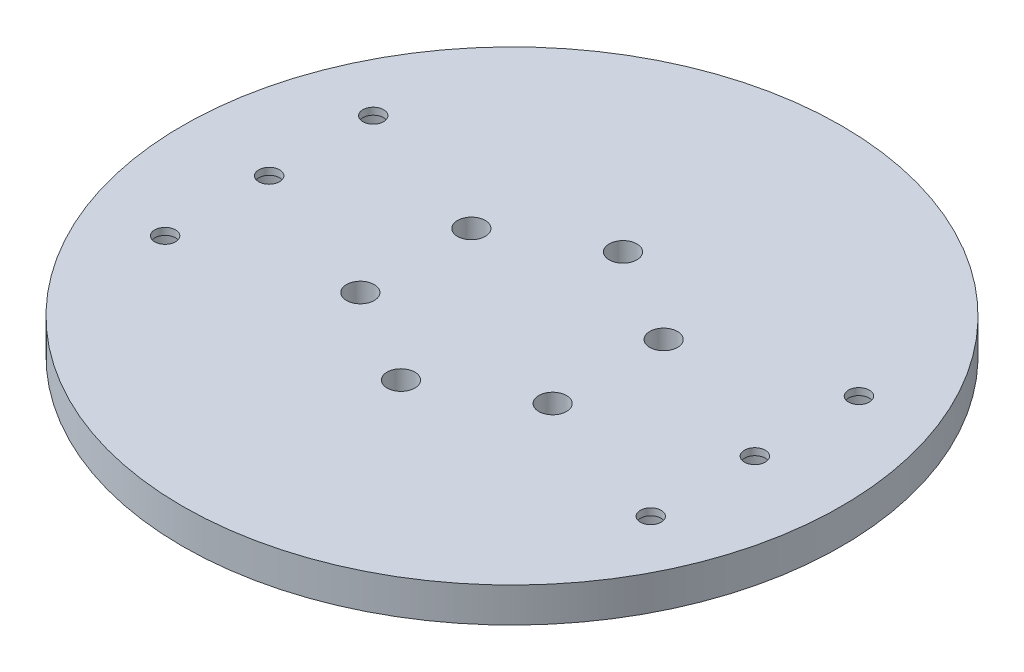
ISO-10303-21;
HEADER;
FILE_DESCRIPTION(('STEP AP214'),'2;1');
FILE_NAME('part.step','',(''),(''),'','','');
FILE_SCHEMA(('AUTOMOTIVE_DESIGN { 1 0 10303 214 1 1 1 1 }'));
ENDSEC;
DATA;
#1=APPLICATION_CONTEXT('core data for automotive mechanical design processes');
#2=APPLICATION_PROTOCOL_DEFINITION('international standard','automotive_design',2000,#1);
#3=PRODUCT_CONTEXT('',#1,'mechanical');
#4=PRODUCT('Part','Part','',(#3));
#5=PRODUCT_RELATED_PRODUCT_CATEGORY('part','',(#4));
#6=PRODUCT_DEFINITION_FORMATION('','',#4);
#7=PRODUCT_DEFINITION_CONTEXT('part definition',#1,'design');
#8=PRODUCT_DEFINITION('design','',#6,#7);
#9=PRODUCT_DEFINITION_SHAPE('','',#8);
#10=(LENGTH_UNIT() NAMED_UNIT(*) SI_UNIT(.MILLI.,.METRE.));
#11=(NAMED_UNIT(*) PLANE_ANGLE_UNIT() SI_UNIT($,.RADIAN.));
#12=(NAMED_UNIT(*) SI_UNIT($,.STERADIAN.) SOLID_ANGLE_UNIT());
#13=UNCERTAINTY_MEASURE_WITH_UNIT(LENGTH_MEASURE(1.E-05),#10,'distance_accuracy_value','');
#14=(GEOMETRIC_REPRESENTATION_CONTEXT(3) GLOBAL_UNCERTAINTY_ASSIGNED_CONTEXT((#13)) GLOBAL_UNIT_ASSIGNED_CONTEXT((#10,
#11,#12)) REPRESENTATION_CONTEXT('',''));
#15=CARTESIAN_POINT('',(0.,0.,0.));
#16=DIRECTION('',(0.,0.,1.));
#17=DIRECTION('',(1.,0.,0.));
#18=AXIS2_PLACEMENT_3D('',#15,#16,#17);
#19=CARTESIAN_POINT('',(-35.,0.,15.));
#20=DIRECTION('',(0.,1.,0.));
#21=DIRECTION('',(0.,0.,1.));
#22=AXIS2_PLACEMENT_3D('',#19,#20,#21);
#23=CYLINDRICAL_SURFACE('',#22,1.5);
#24=CARTESIAN_POINT('',(-35.,9.,15.));
#25=DIRECTION('',(0.,1.,0.));
#26=DIRECTION('',(0.,0.,1.));
#27=AXIS2_PLACEMENT_3D('',#24,#25,#26);
#28=CIRCLE('',#27,1.5);
#29=CARTESIAN_POINT('',(-35.,9.,16.5));
#30=VERTEX_POINT('',#29);
#31=EDGE_CURVE('E91',#30,#30,#28,.T.);
#32=ORIENTED_EDGE('',*,*,#31,.T.);
#33=EDGE_LOOP('',(#32));
#34=FACE_BOUND('',#33,.T.);
#35=CARTESIAN_POINT('',(-35.,8.,15.));
#36=DIRECTION('',(0.,-1.,0.));
#37=DIRECTION('',(0.,0.,-1.));
#38=AXIS2_PLACEMENT_3D('',#35,#36,#37);
#39=CIRCLE('',#38,1.5);
#40=CARTESIAN_POINT('',(-35.,8.,13.5));
#41=VERTEX_POINT('',#40);
#42=EDGE_CURVE('E129',#41,#41,#39,.T.);
#43=ORIENTED_EDGE('',*,*,#42,.T.);
#44=EDGE_LOOP('',(#43));
#45=FACE_BOUND('',#44,.T.);
#46=ADVANCED_FACE('F36',(#34,#45),#23,.F.);
#47=CARTESIAN_POINT('',(-35.,0.,0.));
#48=DIRECTION('',(0.,1.,0.));
#49=DIRECTION('',(0.,0.,1.));
#50=AXIS2_PLACEMENT_3D('',#47,#48,#49);
#51=CYLINDRICAL_SURFACE('',#50,1.5);
#52=CARTESIAN_POINT('',(-35.,9.,0.));
#53=DIRECTION('',(0.,1.,0.));
#54=DIRECTION('',(0.,0.,1.));
#55=AXIS2_PLACEMENT_3D('',#52,#53,#54);
#56=CIRCLE('',#55,1.5);
#57=CARTESIAN_POINT('',(-35.,9.,1.5));
#58=VERTEX_POINT('',#57);
#59=EDGE_CURVE('E94',#58,#58,#56,.T.);
#60=ORIENTED_EDGE('',*,*,#59,.T.);
#61=EDGE_LOOP('',(#60));
#62=FACE_BOUND('',#61,.T.);
#63=CARTESIAN_POINT('',(-35.,8.,0.));
#64=DIRECTION('',(0.,-1.,0.));
#65=DIRECTION('',(0.,0.,-1.));
#66=AXIS2_PLACEMENT_3D('',#63,#64,#65);
#67=CIRCLE('',#66,1.5);
#68=CARTESIAN_POINT('',(-35.,8.,-1.50000000000001));
#69=VERTEX_POINT('',#68);
#70=EDGE_CURVE('E118',#69,#69,#67,.T.);
#71=ORIENTED_EDGE('',*,*,#70,.T.);
#72=EDGE_LOOP('',(#71));
#73=FACE_BOUND('',#72,.T.);
#74=ADVANCED_FACE('F189',(#62,#73),#51,.F.);
#75=CARTESIAN_POINT('',(-35.,0.,-15.));
#76=DIRECTION('',(0.,1.,0.));
#77=DIRECTION('',(0.,0.,1.));
#78=AXIS2_PLACEMENT_3D('',#75,#76,#77);
#79=CYLINDRICAL_SURFACE('',#78,1.5);
#80=CARTESIAN_POINT('',(-35.,9.,-15.));
#81=DIRECTION('',(0.,1.,0.));
#82=DIRECTION('',(0.,0.,1.));
#83=AXIS2_PLACEMENT_3D('',#80,#81,#82);
#84=CIRCLE('',#83,1.5);
#85=CARTESIAN_POINT('',(-35.,9.,-13.5));
#86=VERTEX_POINT('',#85);
#87=EDGE_CURVE('E90',#86,#86,#84,.T.);
#88=ORIENTED_EDGE('',*,*,#87,.T.);
#89=EDGE_LOOP('',(#88));
#90=FACE_BOUND('',#89,.T.);
#91=CARTESIAN_POINT('',(-35.,8.,-15.));
#92=DIRECTION('',(0.,-1.,0.));
#93=DIRECTION('',(0.,0.,-1.));
#94=AXIS2_PLACEMENT_3D('',#91,#92,#93);
#95=CIRCLE('',#94,1.5);
#96=CARTESIAN_POINT('',(-35.,8.,-16.5));
#97=VERTEX_POINT('',#96);
#98=EDGE_CURVE('E126',#97,#97,#95,.T.);
#99=ORIENTED_EDGE('',*,*,#98,.T.);
#100=EDGE_LOOP('',(#99));
#101=FACE_BOUND('',#100,.T.);
#102=ADVANCED_FACE('F195',(#90,#101),#79,.F.);
#103=CARTESIAN_POINT('',(35.,0.,15.));
#104=DIRECTION('',(0.,1.,0.));
#105=DIRECTION('',(0.,0.,1.));
#106=AXIS2_PLACEMENT_3D('',#103,#104,#105);
#107=CYLINDRICAL_SURFACE('',#106,1.5);
#108=CARTESIAN_POINT('',(35.,9.,15.));
#109=DIRECTION('',(0.,-1.,0.));
#110=DIRECTION('',(0.,0.,1.));
#111=AXIS2_PLACEMENT_3D('',#108,#109,#110);
#112=CIRCLE('',#111,1.5);
#113=CARTESIAN_POINT('',(35.,9.,16.5));
#114=VERTEX_POINT('',#113);
#115=EDGE_CURVE('E100',#114,#114,#112,.T.);
#116=ORIENTED_EDGE('',*,*,#115,.F.);
#117=EDGE_LOOP('',(#116));
#118=FACE_BOUND('',#117,.T.);
#119=CARTESIAN_POINT('',(35.,8.,15.));
#120=DIRECTION('',(0.,-1.,0.));
#121=DIRECTION('',(0.,0.,-1.));
#122=AXIS2_PLACEMENT_3D('',#119,#120,#121);
#123=CIRCLE('',#122,1.5);
#124=CARTESIAN_POINT('',(35.,8.,13.5));
#125=VERTEX_POINT('',#124);
#126=EDGE_CURVE('E112',#125,#125,#123,.T.);
#127=ORIENTED_EDGE('',*,*,#126,.T.);
#128=EDGE_LOOP('',(#127));
#129=FACE_BOUND('',#128,.T.);
#130=ADVANCED_FACE('F282',(#118,#129),#107,.F.);
#131=CARTESIAN_POINT('',(35.,0.,0.));
#132=DIRECTION('',(0.,1.,0.));
#133=DIRECTION('',(0.,0.,1.));
#134=AXIS2_PLACEMENT_3D('',#131,#132,#133);
#135=CYLINDRICAL_SURFACE('',#134,1.5);
#136=CARTESIAN_POINT('',(35.,9.,0.));
#137=DIRECTION('',(0.,-1.,0.));
#138=DIRECTION('',(0.,0.,1.));
#139=AXIS2_PLACEMENT_3D('',#136,#137,#138);
#140=CIRCLE('',#139,1.5);
#141=CARTESIAN_POINT('',(35.,9.,1.5));
#142=VERTEX_POINT('',#141);
#143=EDGE_CURVE('E103',#142,#142,#140,.T.);
#144=ORIENTED_EDGE('',*,*,#143,.F.);
#145=EDGE_LOOP('',(#144));
#146=FACE_BOUND('',#145,.T.);
#147=CARTESIAN_POINT('',(35.,8.,0.));
#148=DIRECTION('',(0.,-1.,0.));
#149=DIRECTION('',(0.,0.,-1.));
#150=AXIS2_PLACEMENT_3D('',#147,#148,#149);
#151=CIRCLE('',#150,1.5);
#152=CARTESIAN_POINT('',(35.,8.,-1.50000000000001));
#153=VERTEX_POINT('',#152);
#154=EDGE_CURVE('E117',#153,#153,#151,.T.);
#155=ORIENTED_EDGE('',*,*,#154,.T.);
#156=EDGE_LOOP('',(#155));
#157=FACE_BOUND('',#156,.T.);
#158=ADVANCED_FACE('F276',(#146,#157),#135,.F.);
#159=CARTESIAN_POINT('',(35.,0.,-15.));
#160=DIRECTION('',(0.,1.,0.));
#161=DIRECTION('',(0.,0.,1.));
#162=AXIS2_PLACEMENT_3D('',#159,#160,#161);
#163=CYLINDRICAL_SURFACE('',#162,1.5);
#164=CARTESIAN_POINT('',(35.,9.,-15.));
#165=DIRECTION('',(0.,-1.,0.));
#166=DIRECTION('',(0.,0.,1.));
#167=AXIS2_PLACEMENT_3D('',#164,#165,#166);
#168=CIRCLE('',#167,1.5);
#169=CARTESIAN_POINT('',(35.,9.,-13.5));
#170=VERTEX_POINT('',#169);
#171=EDGE_CURVE('E95',#170,#170,#168,.T.);
#172=ORIENTED_EDGE('',*,*,#171,.F.);
#173=EDGE_LOOP('',(#172));
#174=FACE_BOUND('',#173,.T.);
#175=CARTESIAN_POINT('',(35.,8.,-15.));
#176=DIRECTION('',(0.,-1.,0.));
#177=DIRECTION('',(0.,0.,-1.));
#178=AXIS2_PLACEMENT_3D('',#175,#176,#177);
#179=CIRCLE('',#178,1.5);
#180=CARTESIAN_POINT('',(35.,8.,-16.5));
#181=VERTEX_POINT('',#180);
#182=EDGE_CURVE('E138',#181,#181,#179,.T.);
#183=ORIENTED_EDGE('',*,*,#182,.T.);
#184=EDGE_LOOP('',(#183));
#185=FACE_BOUND('',#184,.T.);
#186=ADVANCED_FACE('F271',(#174,#185),#163,.F.);
#187=CARTESIAN_POINT('',(0.,4.,0.));
#188=DIRECTION('',(0.,-1.,0.));
#189=DIRECTION('',(0.,0.,-1.));
#190=AXIS2_PLACEMENT_3D('',#187,#188,#189);
#191=CYLINDRICAL_SURFACE('',#190,24.5);
#192=CARTESIAN_POINT('',(0.,4.,0.));
#193=DIRECTION('',(0.,1.,0.));
#194=DIRECTION('',(0.,0.,1.));
#195=AXIS2_PLACEMENT_3D('',#192,#193,#194);
#196=CIRCLE('',#195,24.5);
#197=CARTESIAN_POINT('',(0.,4.,24.5));
#198=VERTEX_POINT('',#197);
#199=EDGE_CURVE('E10',#198,#198,#196,.T.);
#200=ORIENTED_EDGE('',*,*,#199,.F.);
#201=EDGE_LOOP('',(#200));
#202=FACE_BOUND('',#201,.T.);
#203=CARTESIAN_POINT('',(0.,0.,0.));
#204=DIRECTION('',(0.,1.,0.));
#205=DIRECTION('',(0.,0.,1.));
#206=AXIS2_PLACEMENT_3D('',#203,#204,#205);
#207=CIRCLE('',#206,24.5);
#208=CARTESIAN_POINT('',(0.,0.,24.5));
#209=VERTEX_POINT('',#208);
#210=EDGE_CURVE('E40',#209,#209,#207,.T.);
#211=ORIENTED_EDGE('',*,*,#210,.T.);
#212=EDGE_LOOP('',(#211));
#213=FACE_BOUND('',#212,.T.);
#214=ADVANCED_FACE('F38',(#202,#213),#191,.T.);
#215=CARTESIAN_POINT('',(0.,0.,0.));
#216=DIRECTION('',(0.,1.,0.));
#217=DIRECTION('',(0.,0.,1.));
#218=AXIS2_PLACEMENT_3D('',#215,#216,#217);
#219=PLANE('',#218);
#220=CARTESIAN_POINT('',(13.8564064605509,0.,-8.00000000000016));
#221=DIRECTION('',(0.,1.,0.));
#222=DIRECTION('',(-0.866025403784433,0.,0.50000000000001));
#223=AXIS2_PLACEMENT_3D('',#220,#221,#222);
#224=CIRCLE('',#223,2.);
#225=CARTESIAN_POINT('',(12.1243556529821,0.,-7.00000000000014));
#226=VERTEX_POINT('',#225);
#227=EDGE_CURVE('E55',#226,#226,#224,.T.);
#228=ORIENTED_EDGE('',*,*,#227,.T.);
#229=EDGE_LOOP('',(#228));
#230=FACE_BOUND('',#229,.T.);
#231=CARTESIAN_POINT('',(13.8564064605511,0.,7.99999999999987));
#232=DIRECTION('',(0.,1.,0.));
#233=DIRECTION('',(-0.866025403784443,0.,-0.499999999999992));
#234=AXIS2_PLACEMENT_3D('',#231,#232,#233);
#235=CIRCLE('',#234,2.);
#236=CARTESIAN_POINT('',(12.1243556529822,0.,6.99999999999989));
#237=VERTEX_POINT('',#236);
#238=EDGE_CURVE('E58',#237,#237,#235,.T.);
#239=ORIENTED_EDGE('',*,*,#238,.T.);
#240=EDGE_LOOP('',(#239));
#241=FACE_BOUND('',#240,.T.);
#242=CARTESIAN_POINT('',(0.,0.,16.));
#243=DIRECTION('',(0.,1.,0.));
#244=DIRECTION('',(0.,0.,-1.));
#245=AXIS2_PLACEMENT_3D('',#242,#243,#244);
#246=CIRCLE('',#245,2.);
#247=CARTESIAN_POINT('',(0.,0.,14.));
#248=VERTEX_POINT('',#247);
#249=EDGE_CURVE('E62',#248,#248,#246,.T.);
#250=ORIENTED_EDGE('',*,*,#249,.T.);
#251=EDGE_LOOP('',(#250));
#252=FACE_BOUND('',#251,.T.);
#253=CARTESIAN_POINT('',(-13.856406460551,0.,8.00000000000007));
#254=DIRECTION('',(0.,1.,0.));
#255=DIRECTION('',(0.866025403784436,0.,-0.500000000000004));
#256=AXIS2_PLACEMENT_3D('',#253,#254,#255);
#257=CIRCLE('',#256,2.);
#258=CARTESIAN_POINT('',(-12.1243556529821,0.,7.00000000000006));
#259=VERTEX_POINT('',#258);
#260=EDGE_CURVE('E54',#259,#259,#257,.T.);
#261=ORIENTED_EDGE('',*,*,#260,.T.);
#262=EDGE_LOOP('',(#261));
#263=FACE_BOUND('',#262,.T.);
#264=CARTESIAN_POINT('',(-13.856406460551,0.,-7.99999999999997));
#265=DIRECTION('',(0.,1.,0.));
#266=DIRECTION('',(0.86602540378444,0.,0.499999999999998));
#267=AXIS2_PLACEMENT_3D('',#264,#265,#266);
#268=CIRCLE('',#267,2.);
#269=CARTESIAN_POINT('',(-12.1243556529822,0.,-6.99999999999997));
#270=VERTEX_POINT('',#269);
#271=EDGE_CURVE('E51',#270,#270,#268,.T.);
#272=ORIENTED_EDGE('',*,*,#271,.T.);
#273=EDGE_LOOP('',(#272));
#274=FACE_BOUND('',#273,.T.);
#275=CARTESIAN_POINT('',(0.,0.,-16.));
#276=DIRECTION('',(0.,1.,0.));
#277=DIRECTION('',(0.,0.,1.));
#278=AXIS2_PLACEMENT_3D('',#275,#276,#277);
#279=CIRCLE('',#278,2.);
#280=CARTESIAN_POINT('',(0.,0.,-14.));
#281=VERTEX_POINT('',#280);
#282=EDGE_CURVE('E47',#281,#281,#279,.T.);
#283=ORIENTED_EDGE('',*,*,#282,.T.);
#284=EDGE_LOOP('',(#283));
#285=FACE_BOUND('',#284,.T.);
#286=ORIENTED_EDGE('',*,*,#210,.F.);
#287=EDGE_LOOP('',(#286));
#288=FACE_BOUND('',#287,.T.);
#289=ADVANCED_FACE('F238',(#230,#241,#252,#263,#274,#285,#288),#219,.F.);
#290=CARTESIAN_POINT('',(0.,0.,-16.));
#291=DIRECTION('',(0.,1.,0.));
#292=DIRECTION('',(0.,0.,1.));
#293=AXIS2_PLACEMENT_3D('',#290,#291,#292);
#294=CYLINDRICAL_SURFACE('',#293,2.);
#295=ORIENTED_EDGE('',*,*,#282,.F.);
#296=EDGE_LOOP('',(#295));
#297=FACE_BOUND('',#296,.T.);
#298=CARTESIAN_POINT('',(0.,9.,-16.));
#299=DIRECTION('',(0.,1.,0.));
#300=DIRECTION('',(0.,0.,1.));
#301=AXIS2_PLACEMENT_3D('',#298,#299,#300);
#302=CIRCLE('',#301,2.);
#303=CARTESIAN_POINT('',(0.,9.,-14.));
#304=VERTEX_POINT('',#303);
#305=EDGE_CURVE('E87',#304,#304,#302,.T.);
#306=ORIENTED_EDGE('',*,*,#305,.T.);
#307=EDGE_LOOP('',(#306));
#308=FACE_BOUND('',#307,.T.);
#309=ADVANCED_FACE('F235',(#297,#308),#294,.F.);
#310=CARTESIAN_POINT('',(-13.856406460551,0.,-7.99999999999997));
#311=DIRECTION('',(0.,1.,0.));
#312=DIRECTION('',(0.,0.,1.));
#313=AXIS2_PLACEMENT_3D('',#310,#311,#312);
#314=CYLINDRICAL_SURFACE('',#313,2.);
#315=ORIENTED_EDGE('',*,*,#271,.F.);
#316=EDGE_LOOP('',(#315));
#317=FACE_BOUND('',#316,.T.);
#318=CARTESIAN_POINT('',(-13.856406460551,9.,-7.99999999999997));
#319=DIRECTION('',(0.,1.,0.));
#320=DIRECTION('',(0.,0.,1.));
#321=AXIS2_PLACEMENT_3D('',#318,#319,#320);
#322=CIRCLE('',#321,2.);
#323=CARTESIAN_POINT('',(-13.856406460551,9.,-5.99999999999997));
#324=VERTEX_POINT('',#323);
#325=EDGE_CURVE('E84',#324,#324,#322,.T.);
#326=ORIENTED_EDGE('',*,*,#325,.T.);
#327=EDGE_LOOP('',(#326));
#328=FACE_BOUND('',#327,.T.);
#329=ADVANCED_FACE('F237',(#317,#328),#314,.F.);
#330=CARTESIAN_POINT('',(-13.856406460551,0.,8.00000000000007));
#331=DIRECTION('',(0.,1.,0.));
#332=DIRECTION('',(0.,0.,1.));
#333=AXIS2_PLACEMENT_3D('',#330,#331,#332);
#334=CYLINDRICAL_SURFACE('',#333,2.);
#335=ORIENTED_EDGE('',*,*,#260,.F.);
#336=EDGE_LOOP('',(#335));
#337=FACE_BOUND('',#336,.T.);
#338=CARTESIAN_POINT('',(-13.856406460551,9.,8.00000000000007));
#339=DIRECTION('',(0.,1.,0.));
#340=DIRECTION('',(0.,0.,1.));
#341=AXIS2_PLACEMENT_3D('',#338,#339,#340);
#342=CIRCLE('',#341,2.);
#343=CARTESIAN_POINT('',(-13.856406460551,9.,10.0000000000001));
#344=VERTEX_POINT('',#343);
#345=EDGE_CURVE('E81',#344,#344,#342,.T.);
#346=ORIENTED_EDGE('',*,*,#345,.T.);
#347=EDGE_LOOP('',(#346));
#348=FACE_BOUND('',#347,.T.);
#349=ADVANCED_FACE('F245',(#337,#348),#334,.F.);
#350=CARTESIAN_POINT('',(0.,0.,16.));
#351=DIRECTION('',(0.,1.,0.));
#352=DIRECTION('',(0.,0.,1.));
#353=AXIS2_PLACEMENT_3D('',#350,#351,#352);
#354=CYLINDRICAL_SURFACE('',#353,2.);
#355=ORIENTED_EDGE('',*,*,#249,.F.);
#356=EDGE_LOOP('',(#355));
#357=FACE_BOUND('',#356,.T.);
#358=CARTESIAN_POINT('',(0.,9.,16.));
#359=DIRECTION('',(0.,1.,0.));
#360=DIRECTION('',(0.,0.,1.));
#361=AXIS2_PLACEMENT_3D('',#358,#359,#360);
#362=CIRCLE('',#361,2.);
#363=CARTESIAN_POINT('',(0.,9.,18.));
#364=VERTEX_POINT('',#363);
#365=EDGE_CURVE('E78',#364,#364,#362,.T.);
#366=ORIENTED_EDGE('',*,*,#365,.T.);
#367=EDGE_LOOP('',(#366));
#368=FACE_BOUND('',#367,.T.);
#369=ADVANCED_FACE('F253',(#357,#368),#354,.F.);
#370=CARTESIAN_POINT('',(13.8564064605511,0.,7.99999999999987));
#371=DIRECTION('',(0.,1.,0.));
#372=DIRECTION('',(0.,0.,1.));
#373=AXIS2_PLACEMENT_3D('',#370,#371,#372);
#374=CYLINDRICAL_SURFACE('',#373,2.);
#375=ORIENTED_EDGE('',*,*,#238,.F.);
#376=EDGE_LOOP('',(#375));
#377=FACE_BOUND('',#376,.T.);
#378=CARTESIAN_POINT('',(13.8564064605511,9.,7.99999999999987));
#379=DIRECTION('',(0.,1.,0.));
#380=DIRECTION('',(0.,0.,1.));
#381=AXIS2_PLACEMENT_3D('',#378,#379,#380);
#382=CIRCLE('',#381,2.);
#383=CARTESIAN_POINT('',(13.8564064605511,9.,9.99999999999987));
#384=VERTEX_POINT('',#383);
#385=EDGE_CURVE('E75',#384,#384,#382,.T.);
#386=ORIENTED_EDGE('',*,*,#385,.T.);
#387=EDGE_LOOP('',(#386));
#388=FACE_BOUND('',#387,.T.);
#389=ADVANCED_FACE('F207',(#377,#388),#374,.F.);
#390=CARTESIAN_POINT('',(13.8564064605509,0.,-8.00000000000016));
#391=DIRECTION('',(0.,1.,0.));
#392=DIRECTION('',(0.,0.,1.));
#393=AXIS2_PLACEMENT_3D('',#390,#391,#392);
#394=CYLINDRICAL_SURFACE('',#393,2.);
#395=ORIENTED_EDGE('',*,*,#227,.F.);
#396=EDGE_LOOP('',(#395));
#397=FACE_BOUND('',#396,.T.);
#398=CARTESIAN_POINT('',(13.8564064605509,9.,-8.00000000000016));
#399=DIRECTION('',(0.,1.,0.));
#400=DIRECTION('',(0.,0.,1.));
#401=AXIS2_PLACEMENT_3D('',#398,#399,#400);
#402=CIRCLE('',#401,2.);
#403=CARTESIAN_POINT('',(13.8564064605509,9.,-6.00000000000016));
#404=VERTEX_POINT('',#403);
#405=EDGE_CURVE('E70',#404,#404,#402,.T.);
#406=ORIENTED_EDGE('',*,*,#405,.T.);
#407=EDGE_LOOP('',(#406));
#408=FACE_BOUND('',#407,.T.);
#409=ADVANCED_FACE('F202',(#397,#408),#394,.F.);
#410=CARTESIAN_POINT('',(0.,9.,0.));
#411=DIRECTION('',(0.,1.,0.));
#412=DIRECTION('',(0.,0.,1.));
#413=AXIS2_PLACEMENT_3D('',#410,#411,#412);
#414=PLANE('',#413);
#415=ORIENTED_EDGE('',*,*,#171,.T.);
#416=EDGE_LOOP('',(#415));
#417=FACE_BOUND('',#416,.T.);
#418=ORIENTED_EDGE('',*,*,#143,.T.);
#419=EDGE_LOOP('',(#418));
#420=FACE_BOUND('',#419,.T.);
#421=ORIENTED_EDGE('',*,*,#115,.T.);
#422=EDGE_LOOP('',(#421));
#423=FACE_BOUND('',#422,.T.);
#424=ORIENTED_EDGE('',*,*,#87,.F.);
#425=EDGE_LOOP('',(#424));
#426=FACE_BOUND('',#425,.T.);
#427=ORIENTED_EDGE('',*,*,#59,.F.);
#428=EDGE_LOOP('',(#427));
#429=FACE_BOUND('',#428,.T.);
#430=ORIENTED_EDGE('',*,*,#31,.F.);
#431=EDGE_LOOP('',(#430));
#432=FACE_BOUND('',#431,.T.);
#433=ORIENTED_EDGE('',*,*,#325,.F.);
#434=EDGE_LOOP('',(#433));
#435=FACE_BOUND('',#434,.T.);
#436=ORIENTED_EDGE('',*,*,#365,.F.);
#437=EDGE_LOOP('',(#436));
#438=FACE_BOUND('',#437,.T.);
#439=ORIENTED_EDGE('',*,*,#405,.F.);
#440=EDGE_LOOP('',(#439));
#441=FACE_BOUND('',#440,.T.);
#442=CARTESIAN_POINT('',(0.,9.,0.));
#443=DIRECTION('',(0.,1.,0.));
#444=DIRECTION('',(0.,0.,1.));
#445=AXIS2_PLACEMENT_3D('',#442,#443,#444);
#446=CIRCLE('',#445,47.5);
#447=CARTESIAN_POINT('',(0.,9.,47.5));
#448=VERTEX_POINT('',#447);
#449=EDGE_CURVE('E59',#448,#448,#446,.T.);
#450=ORIENTED_EDGE('',*,*,#449,.T.);
#451=EDGE_LOOP('',(#450));
#452=FACE_BOUND('',#451,.T.);
#453=ORIENTED_EDGE('',*,*,#385,.F.);
#454=EDGE_LOOP('',(#453));
#455=FACE_BOUND('',#454,.T.);
#456=ORIENTED_EDGE('',*,*,#345,.F.);
#457=EDGE_LOOP('',(#456));
#458=FACE_BOUND('',#457,.T.);
#459=ORIENTED_EDGE('',*,*,#305,.F.);
#460=EDGE_LOOP('',(#459));
#461=FACE_BOUND('',#460,.T.);
#462=ADVANCED_FACE('F169',(#417,#420,#423,#426,#429,#432,#435,#438,#441,#452,#455,#458,#461),
#414,.T.);
#463=CARTESIAN_POINT('',(0.,4.,0.));
#464=DIRECTION('',(0.,1.,0.));
#465=DIRECTION('',(0.,0.,1.));
#466=AXIS2_PLACEMENT_3D('',#463,#464,#465);
#467=PLANE('',#466);
#468=CARTESIAN_POINT('',(35.,4.,0.));
#469=DIRECTION('',(0.,-1.,0.));
#470=DIRECTION('',(0.,0.,-1.));
#471=AXIS2_PLACEMENT_3D('',#468,#469,#470);
#472=CIRCLE('',#471,3.5);
#473=CARTESIAN_POINT('',(35.,4.,-3.5));
#474=VERTEX_POINT('',#473);
#475=EDGE_CURVE('E149',#474,#474,#472,.T.);
#476=ORIENTED_EDGE('',*,*,#475,.F.);
#477=EDGE_LOOP('',(#476));
#478=FACE_BOUND('',#477,.T.);
#479=CARTESIAN_POINT('',(35.,4.,-15.));
#480=DIRECTION('',(0.,-1.,0.));
#481=DIRECTION('',(0.,0.,-1.));
#482=AXIS2_PLACEMENT_3D('',#479,#480,#481);
#483=CIRCLE('',#482,3.5);
#484=CARTESIAN_POINT('',(35.,4.,-18.5));
#485=VERTEX_POINT('',#484);
#486=EDGE_CURVE('E142',#485,#485,#483,.T.);
#487=ORIENTED_EDGE('',*,*,#486,.F.);
#488=EDGE_LOOP('',(#487));
#489=FACE_BOUND('',#488,.T.);
#490=CARTESIAN_POINT('',(-35.,4.,15.));
#491=DIRECTION('',(0.,-1.,0.));
#492=DIRECTION('',(0.,0.,-1.));
#493=AXIS2_PLACEMENT_3D('',#490,#491,#492);
#494=CIRCLE('',#493,3.5);
#495=CARTESIAN_POINT('',(-35.,4.,11.5));
#496=VERTEX_POINT('',#495);
#497=EDGE_CURVE('E133',#496,#496,#494,.T.);
#498=ORIENTED_EDGE('',*,*,#497,.F.);
#499=EDGE_LOOP('',(#498));
#500=FACE_BOUND('',#499,.T.);
#501=CARTESIAN_POINT('',(-35.,4.,0.));
#502=DIRECTION('',(0.,-1.,0.));
#503=DIRECTION('',(0.,0.,-1.));
#504=AXIS2_PLACEMENT_3D('',#501,#502,#503);
#505=CIRCLE('',#504,3.5);
#506=CARTESIAN_POINT('',(-35.,4.,-3.5));
#507=VERTEX_POINT('',#506);
#508=EDGE_CURVE('E122',#507,#507,#505,.T.);
#509=ORIENTED_EDGE('',*,*,#508,.F.);
#510=EDGE_LOOP('',(#509));
#511=FACE_BOUND('',#510,.T.);
#512=CARTESIAN_POINT('',(-35.,4.,-15.));
#513=DIRECTION('',(0.,-1.,0.));
#514=DIRECTION('',(0.,0.,-1.));
#515=AXIS2_PLACEMENT_3D('',#512,#513,#514);
#516=CIRCLE('',#515,3.5);
#517=CARTESIAN_POINT('',(-35.,4.,-18.5));
#518=VERTEX_POINT('',#517);
#519=EDGE_CURVE('E156',#518,#518,#516,.T.);
#520=ORIENTED_EDGE('',*,*,#519,.F.);
#521=EDGE_LOOP('',(#520));
#522=FACE_BOUND('',#521,.T.);
#523=CARTESIAN_POINT('',(35.,4.,15.));
#524=DIRECTION('',(0.,-1.,0.));
#525=DIRECTION('',(0.,0.,-1.));
#526=AXIS2_PLACEMENT_3D('',#523,#524,#525);
#527=CIRCLE('',#526,3.5);
#528=CARTESIAN_POINT('',(35.,4.,11.5));
#529=VERTEX_POINT('',#528);
#530=EDGE_CURVE('E109',#529,#529,#527,.T.);
#531=ORIENTED_EDGE('',*,*,#530,.F.);
#532=EDGE_LOOP('',(#531));
#533=FACE_BOUND('',#532,.T.);
#534=ORIENTED_EDGE('',*,*,#199,.T.);
#535=EDGE_LOOP('',(#534));
#536=FACE_BOUND('',#535,.T.);
#537=CARTESIAN_POINT('',(0.,4.,0.));
#538=DIRECTION('',(0.,1.,0.));
#539=DIRECTION('',(0.,0.,1.));
#540=AXIS2_PLACEMENT_3D('',#537,#538,#539);
#541=CIRCLE('',#540,47.5);
#542=CARTESIAN_POINT('',(0.,4.,47.5));
#543=VERTEX_POINT('',#542);
#544=EDGE_CURVE('E67',#543,#543,#541,.T.);
#545=ORIENTED_EDGE('',*,*,#544,.F.);
#546=EDGE_LOOP('',(#545));
#547=FACE_BOUND('',#546,.T.);
#548=ADVANCED_FACE('F165',(#478,#489,#500,#511,#522,#533,#536,#547),#467,.F.);
#549=CARTESIAN_POINT('',(0.,9.,0.));
#550=DIRECTION('',(0.,-1.,0.));
#551=DIRECTION('',(0.,0.,-1.));
#552=AXIS2_PLACEMENT_3D('',#549,#550,#551);
#553=CYLINDRICAL_SURFACE('',#552,47.5);
#554=ORIENTED_EDGE('',*,*,#449,.F.);
#555=EDGE_LOOP('',(#554));
#556=FACE_BOUND('',#555,.T.);
#557=ORIENTED_EDGE('',*,*,#544,.T.);
#558=EDGE_LOOP('',(#557));
#559=FACE_BOUND('',#558,.T.);
#560=ADVANCED_FACE('F168',(#556,#559),#553,.T.);
#561=CARTESIAN_POINT('',(35.,8.,-15.));
#562=DIRECTION('',(0.,-1.,0.));
#563=DIRECTION('',(0.,0.,-1.));
#564=AXIS2_PLACEMENT_3D('',#561,#562,#563);
#565=CYLINDRICAL_SURFACE('',#564,3.5);
#566=CARTESIAN_POINT('',(35.,8.,-15.));
#567=DIRECTION('',(0.,-1.,0.));
#568=DIRECTION('',(0.,0.,-1.));
#569=AXIS2_PLACEMENT_3D('',#566,#567,#568);
#570=CIRCLE('',#569,3.5);
#571=CARTESIAN_POINT('',(35.,8.,-18.5));
#572=VERTEX_POINT('',#571);
#573=EDGE_CURVE('E132',#572,#572,#570,.T.);
#574=ORIENTED_EDGE('',*,*,#573,.F.);
#575=EDGE_LOOP('',(#574));
#576=FACE_BOUND('',#575,.T.);
#577=ORIENTED_EDGE('',*,*,#486,.T.);
#578=EDGE_LOOP('',(#577));
#579=FACE_BOUND('',#578,.T.);
#580=ADVANCED_FACE('F177',(#576,#579),#565,.F.);
#581=CARTESIAN_POINT('',(35.,8.,-15.));
#582=DIRECTION('',(0.,-1.,0.));
#583=DIRECTION('',(0.,0.,-1.));
#584=AXIS2_PLACEMENT_3D('',#581,#582,#583);
#585=PLANE('',#584);
#586=ORIENTED_EDGE('',*,*,#182,.F.);
#587=EDGE_LOOP('',(#586));
#588=FACE_BOUND('',#587,.T.);
#589=ORIENTED_EDGE('',*,*,#573,.T.);
#590=EDGE_LOOP('',(#589));
#591=FACE_BOUND('',#590,.T.);
#592=ADVANCED_FACE('F183',(#588,#591),#585,.T.);
#593=CARTESIAN_POINT('',(35.,8.,0.));
#594=DIRECTION('',(0.,-1.,0.));
#595=DIRECTION('',(0.,0.,-1.));
#596=AXIS2_PLACEMENT_3D('',#593,#594,#595);
#597=CYLINDRICAL_SURFACE('',#596,3.5);
#598=CARTESIAN_POINT('',(35.,8.,0.));
#599=DIRECTION('',(0.,-1.,0.));
#600=DIRECTION('',(0.,0.,-1.));
#601=AXIS2_PLACEMENT_3D('',#598,#599,#600);
#602=CIRCLE('',#601,3.5);
#603=CARTESIAN_POINT('',(35.,8.,-3.5));
#604=VERTEX_POINT('',#603);
#605=EDGE_CURVE('E141',#604,#604,#602,.T.);
#606=ORIENTED_EDGE('',*,*,#605,.F.);
#607=EDGE_LOOP('',(#606));
#608=FACE_BOUND('',#607,.T.);
#609=ORIENTED_EDGE('',*,*,#475,.T.);
#610=EDGE_LOOP('',(#609));
#611=FACE_BOUND('',#610,.T.);
#612=ADVANCED_FACE('F314',(#608,#611),#597,.F.);
#613=CARTESIAN_POINT('',(35.,8.,0.));
#614=DIRECTION('',(0.,-1.,0.));
#615=DIRECTION('',(0.,0.,-1.));
#616=AXIS2_PLACEMENT_3D('',#613,#614,#615);
#617=PLANE('',#616);
#618=ORIENTED_EDGE('',*,*,#154,.F.);
#619=EDGE_LOOP('',(#618));
#620=FACE_BOUND('',#619,.T.);
#621=ORIENTED_EDGE('',*,*,#605,.T.);
#622=EDGE_LOOP('',(#621));
#623=FACE_BOUND('',#622,.T.);
#624=ADVANCED_FACE('F317',(#620,#623),#617,.T.);
#625=CARTESIAN_POINT('',(35.,8.,15.));
#626=DIRECTION('',(0.,-1.,0.));
#627=DIRECTION('',(0.,0.,-1.));
#628=AXIS2_PLACEMENT_3D('',#625,#626,#627);
#629=CYLINDRICAL_SURFACE('',#628,3.5);
#630=CARTESIAN_POINT('',(35.,8.,15.));
#631=DIRECTION('',(0.,-1.,0.));
#632=DIRECTION('',(0.,0.,-1.));
#633=AXIS2_PLACEMENT_3D('',#630,#631,#632);
#634=CIRCLE('',#633,3.5);
#635=CARTESIAN_POINT('',(35.,8.,11.5));
#636=VERTEX_POINT('',#635);
#637=EDGE_CURVE('E104',#636,#636,#634,.T.);
#638=ORIENTED_EDGE('',*,*,#637,.F.);
#639=EDGE_LOOP('',(#638));
#640=FACE_BOUND('',#639,.T.);
#641=ORIENTED_EDGE('',*,*,#530,.T.);
#642=EDGE_LOOP('',(#641));
#643=FACE_BOUND('',#642,.T.);
#644=ADVANCED_FACE('F287',(#640,#643),#629,.F.);
#645=CARTESIAN_POINT('',(35.,8.,15.));
#646=DIRECTION('',(0.,-1.,0.));
#647=DIRECTION('',(0.,0.,-1.));
#648=AXIS2_PLACEMENT_3D('',#645,#646,#647);
#649=PLANE('',#648);
#650=ORIENTED_EDGE('',*,*,#126,.F.);
#651=EDGE_LOOP('',(#650));
#652=FACE_BOUND('',#651,.T.);
#653=ORIENTED_EDGE('',*,*,#637,.T.);
#654=EDGE_LOOP('',(#653));
#655=FACE_BOUND('',#654,.T.);
#656=ADVANCED_FACE('F307',(#652,#655),#649,.T.);
#657=CARTESIAN_POINT('',(-35.,8.,-15.));
#658=DIRECTION('',(0.,-1.,0.));
#659=DIRECTION('',(0.,0.,-1.));
#660=AXIS2_PLACEMENT_3D('',#657,#658,#659);
#661=CYLINDRICAL_SURFACE('',#660,3.5);
#662=CARTESIAN_POINT('',(-35.,8.,-15.));
#663=DIRECTION('',(0.,-1.,0.));
#664=DIRECTION('',(0.,0.,-1.));
#665=AXIS2_PLACEMENT_3D('',#662,#663,#664);
#666=CIRCLE('',#665,3.5);
#667=CARTESIAN_POINT('',(-35.,8.,-18.5));
#668=VERTEX_POINT('',#667);
#669=EDGE_CURVE('E157',#668,#668,#666,.T.);
#670=ORIENTED_EDGE('',*,*,#669,.F.);
#671=EDGE_LOOP('',(#670));
#672=FACE_BOUND('',#671,.T.);
#673=ORIENTED_EDGE('',*,*,#519,.T.);
#674=EDGE_LOOP('',(#673));
#675=FACE_BOUND('',#674,.T.);
#676=ADVANCED_FACE('F163',(#672,#675),#661,.F.);
#677=CARTESIAN_POINT('',(-35.,8.,-15.));
#678=DIRECTION('',(0.,-1.,0.));
#679=DIRECTION('',(0.,0.,-1.));
#680=AXIS2_PLACEMENT_3D('',#677,#678,#679);
#681=PLANE('',#680);
#682=ORIENTED_EDGE('',*,*,#98,.F.);
#683=EDGE_LOOP('',(#682));
#684=FACE_BOUND('',#683,.T.);
#685=ORIENTED_EDGE('',*,*,#669,.T.);
#686=EDGE_LOOP('',(#685));
#687=FACE_BOUND('',#686,.T.);
#688=ADVANCED_FACE('F299',(#684,#687),#681,.T.);
#689=CARTESIAN_POINT('',(-35.,8.,0.));
#690=DIRECTION('',(0.,-1.,0.));
#691=DIRECTION('',(0.,0.,-1.));
#692=AXIS2_PLACEMENT_3D('',#689,#690,#691);
#693=CYLINDRICAL_SURFACE('',#692,3.5);
#694=CARTESIAN_POINT('',(-35.,8.,0.));
#695=DIRECTION('',(0.,-1.,0.));
#696=DIRECTION('',(0.,0.,-1.));
#697=AXIS2_PLACEMENT_3D('',#694,#695,#696);
#698=CIRCLE('',#697,3.5);
#699=CARTESIAN_POINT('',(-35.,8.,-3.5));
#700=VERTEX_POINT('',#699);
#701=EDGE_CURVE('E123',#700,#700,#698,.T.);
#702=ORIENTED_EDGE('',*,*,#701,.F.);
#703=EDGE_LOOP('',(#702));
#704=FACE_BOUND('',#703,.T.);
#705=ORIENTED_EDGE('',*,*,#508,.T.);
#706=EDGE_LOOP('',(#705));
#707=FACE_BOUND('',#706,.T.);
#708=ADVANCED_FACE('F302',(#704,#707),#693,.F.);
#709=CARTESIAN_POINT('',(-35.,8.,0.));
#710=DIRECTION('',(0.,-1.,0.));
#711=DIRECTION('',(0.,0.,-1.));
#712=AXIS2_PLACEMENT_3D('',#709,#710,#711);
#713=PLANE('',#712);
#714=ORIENTED_EDGE('',*,*,#70,.F.);
#715=EDGE_LOOP('',(#714));
#716=FACE_BOUND('',#715,.T.);
#717=ORIENTED_EDGE('',*,*,#701,.T.);
#718=EDGE_LOOP('',(#717));
#719=FACE_BOUND('',#718,.T.);
#720=ADVANCED_FACE('F329',(#716,#719),#713,.T.);
#721=CARTESIAN_POINT('',(-35.,8.,15.));
#722=DIRECTION('',(0.,-1.,0.));
#723=DIRECTION('',(0.,0.,-1.));
#724=AXIS2_PLACEMENT_3D('',#721,#722,#723);
#725=CYLINDRICAL_SURFACE('',#724,3.5);
#726=CARTESIAN_POINT('',(-35.,8.,15.));
#727=DIRECTION('',(0.,-1.,0.));
#728=DIRECTION('',(0.,0.,-1.));
#729=AXIS2_PLACEMENT_3D('',#726,#727,#728);
#730=CIRCLE('',#729,3.5);
#731=CARTESIAN_POINT('',(-35.,8.,11.5));
#732=VERTEX_POINT('',#731);
#733=EDGE_CURVE('E121',#732,#732,#730,.T.);
#734=ORIENTED_EDGE('',*,*,#733,.F.);
#735=EDGE_LOOP('',(#734));
#736=FACE_BOUND('',#735,.T.);
#737=ORIENTED_EDGE('',*,*,#497,.T.);
#738=EDGE_LOOP('',(#737));
#739=FACE_BOUND('',#738,.T.);
#740=ADVANCED_FACE('F325',(#736,#739),#725,.F.);
#741=CARTESIAN_POINT('',(-35.,8.,15.));
#742=DIRECTION('',(0.,-1.,0.));
#743=DIRECTION('',(0.,0.,-1.));
#744=AXIS2_PLACEMENT_3D('',#741,#742,#743);
#745=PLANE('',#744);
#746=ORIENTED_EDGE('',*,*,#42,.F.);
#747=EDGE_LOOP('',(#746));
#748=FACE_BOUND('',#747,.T.);
#749=ORIENTED_EDGE('',*,*,#733,.T.);
#750=EDGE_LOOP('',(#749));
#751=FACE_BOUND('',#750,.T.);
#752=ADVANCED_FACE('F328',(#748,#751),#745,.T.);
#753=CLOSED_SHELL('',(#46,#74,#102,#130,#158,#186,#214,#289,#309,#329,#349,#369,#389,#409,#462,
#548,#560,#580,#592,#612,#624,#644,#656,#676,#688,#708,#720,#740,#752));
#754=MANIFOLD_SOLID_BREP('B2',#753);
#755=ADVANCED_BREP_SHAPE_REPRESENTATION('',(#18,#754),#14);
#756=SHAPE_DEFINITION_REPRESENTATION(#9,#755);
ENDSEC;
END-ISO-10303-21;
